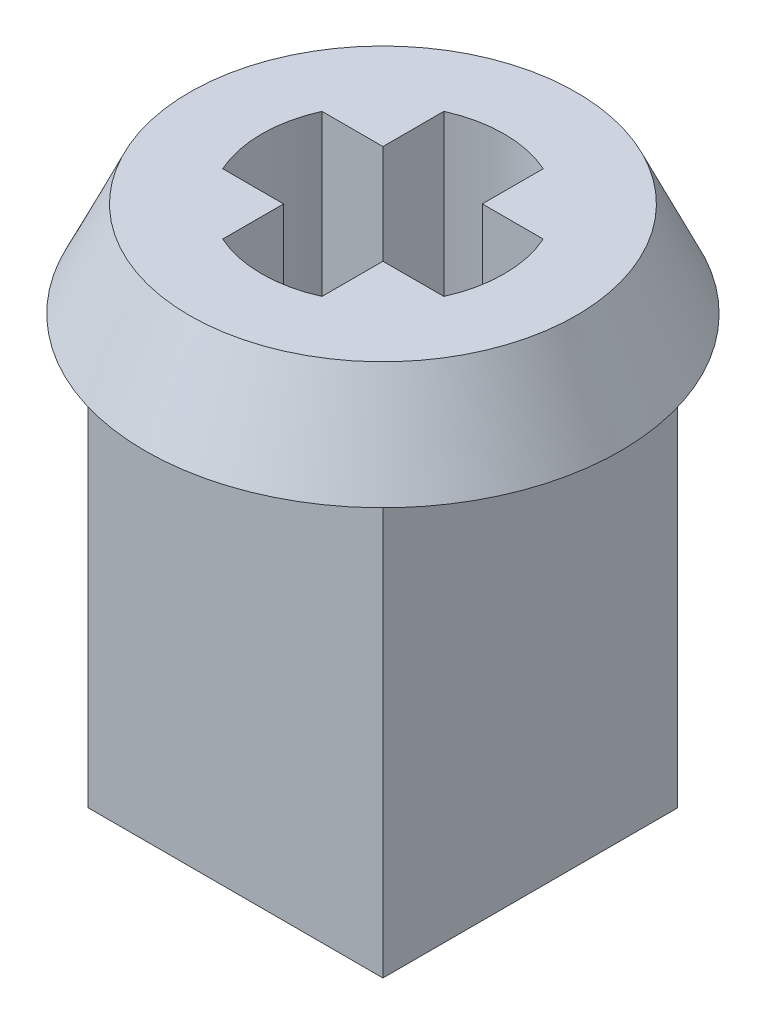
ISO-10303-21;
HEADER;
FILE_DESCRIPTION(('STEP AP214'),'2;1');
FILE_NAME('part.step','',(''),(''),'','','');
FILE_SCHEMA(('AUTOMOTIVE_DESIGN { 1 0 10303 214 1 1 1 1 }'));
ENDSEC;
DATA;
#1=APPLICATION_CONTEXT('core data for automotive mechanical design processes');
#2=APPLICATION_PROTOCOL_DEFINITION('international standard','automotive_design',2000,#1);
#3=PRODUCT_CONTEXT('',#1,'mechanical');
#4=PRODUCT('Part','Part','',(#3));
#5=PRODUCT_RELATED_PRODUCT_CATEGORY('part','',(#4));
#6=PRODUCT_DEFINITION_FORMATION('','',#4);
#7=PRODUCT_DEFINITION_CONTEXT('part definition',#1,'design');
#8=PRODUCT_DEFINITION('design','',#6,#7);
#9=PRODUCT_DEFINITION_SHAPE('','',#8);
#10=(LENGTH_UNIT() NAMED_UNIT(*) SI_UNIT(.MILLI.,.METRE.));
#11=(NAMED_UNIT(*) PLANE_ANGLE_UNIT() SI_UNIT($,.RADIAN.));
#12=(NAMED_UNIT(*) SI_UNIT($,.STERADIAN.) SOLID_ANGLE_UNIT());
#13=UNCERTAINTY_MEASURE_WITH_UNIT(LENGTH_MEASURE(1.E-05),#10,'distance_accuracy_value','');
#14=(GEOMETRIC_REPRESENTATION_CONTEXT(3) GLOBAL_UNCERTAINTY_ASSIGNED_CONTEXT((#13)) GLOBAL_UNIT_ASSIGNED_CONTEXT((#10,
#11,#12)) REPRESENTATION_CONTEXT('',''));
#15=CARTESIAN_POINT('',(0.,0.,0.));
#16=DIRECTION('',(0.,0.,1.));
#17=DIRECTION('',(1.,0.,0.));
#18=AXIS2_PLACEMENT_3D('',#15,#16,#17);
#19=CARTESIAN_POINT('',(0.,0.,0.));
#20=DIRECTION('',(0.,-1.,0.));
#21=DIRECTION('',(0.,0.,-1.));
#22=AXIS2_PLACEMENT_3D('',#19,#20,#21);
#23=PLANE('',#22);
#24=DIRECTION('',(0.,0.,-1.));
#25=VECTOR('',#24,1.);
#26=CARTESIAN_POINT('',(3.1,0.,3.1));
#27=LINE('',#26,#25);
#28=CARTESIAN_POINT('',(3.1,0.,3.1));
#29=VERTEX_POINT('',#28);
#30=CARTESIAN_POINT('',(3.1,0.,-3.1));
#31=VERTEX_POINT('',#30);
#32=EDGE_CURVE('E230',#29,#31,#27,.T.);
#33=ORIENTED_EDGE('',*,*,#32,.F.);
#34=DIRECTION('',(1.,0.,0.));
#35=VECTOR('',#34,1.);
#36=CARTESIAN_POINT('',(-3.1,0.,3.1));
#37=LINE('',#36,#35);
#38=CARTESIAN_POINT('',(-3.1,0.,3.1));
#39=VERTEX_POINT('',#38);
#40=EDGE_CURVE('E235',#39,#29,#37,.T.);
#41=ORIENTED_EDGE('',*,*,#40,.F.);
#42=DIRECTION('',(0.,0.,1.));
#43=VECTOR('',#42,1.);
#44=CARTESIAN_POINT('',(-3.1,0.,3.1));
#45=LINE('',#44,#43);
#46=CARTESIAN_POINT('',(-3.1,0.,-3.1));
#47=VERTEX_POINT('',#46);
#48=EDGE_CURVE('E249',#47,#39,#45,.T.);
#49=ORIENTED_EDGE('',*,*,#48,.F.);
#50=DIRECTION('',(-1.,0.,0.));
#51=VECTOR('',#50,1.);
#52=CARTESIAN_POINT('',(-3.1,0.,-3.1));
#53=LINE('',#52,#51);
#54=EDGE_CURVE('E247',#31,#47,#53,.T.);
#55=ORIENTED_EDGE('',*,*,#54,.F.);
#56=EDGE_LOOP('',(#33,#41,#49,#55));
#57=FACE_BOUND('',#56,.T.);
#58=CARTESIAN_POINT('',(0.,0.,0.));
#59=DIRECTION('',(0.,-1.,0.));
#60=DIRECTION('',(0.,0.,-1.));
#61=AXIS2_PLACEMENT_3D('',#58,#59,#60);
#62=CIRCLE('',#61,2.55);
#63=CARTESIAN_POINT('',(1.045,0.,2.32604277690674));
#64=VERTEX_POINT('',#63);
#65=CARTESIAN_POINT('',(-1.045,0.,2.32604277690674));
#66=VERTEX_POINT('',#65);
#67=EDGE_CURVE('E172',#64,#66,#62,.T.);
#68=ORIENTED_EDGE('',*,*,#67,.F.);
#69=DIRECTION('',(0.,0.,-1.));
#70=VECTOR('',#69,1.);
#71=CARTESIAN_POINT('',(1.045,0.,0.));
#72=LINE('',#71,#70);
#73=CARTESIAN_POINT('',(1.045,0.,1.045));
#74=VERTEX_POINT('',#73);
#75=EDGE_CURVE('E55',#64,#74,#72,.T.);
#76=ORIENTED_EDGE('',*,*,#75,.T.);
#77=DIRECTION('',(-1.,0.,0.));
#78=VECTOR('',#77,1.);
#79=CARTESIAN_POINT('',(0.,0.,1.045));
#80=LINE('',#79,#78);
#81=CARTESIAN_POINT('',(2.32604277690673,0.,1.045));
#82=VERTEX_POINT('',#81);
#83=EDGE_CURVE('E165',#82,#74,#80,.T.);
#84=ORIENTED_EDGE('',*,*,#83,.F.);
#85=CARTESIAN_POINT('',(0.,0.,0.));
#86=DIRECTION('',(0.,-1.,0.));
#87=DIRECTION('',(0.,0.,-1.));
#88=AXIS2_PLACEMENT_3D('',#85,#86,#87);
#89=CIRCLE('',#88,2.55);
#90=CARTESIAN_POINT('',(2.32604277690673,0.,-1.045));
#91=VERTEX_POINT('',#90);
#92=EDGE_CURVE('E203',#91,#82,#89,.T.);
#93=ORIENTED_EDGE('',*,*,#92,.F.);
#94=DIRECTION('',(-1.,0.,0.));
#95=VECTOR('',#94,1.);
#96=CARTESIAN_POINT('',(0.,0.,-1.045));
#97=LINE('',#96,#95);
#98=CARTESIAN_POINT('',(1.045,0.,-1.045));
#99=VERTEX_POINT('',#98);
#100=EDGE_CURVE('E200',#91,#99,#97,.T.);
#101=ORIENTED_EDGE('',*,*,#100,.T.);
#102=DIRECTION('',(0.,0.,-1.));
#103=VECTOR('',#102,1.);
#104=CARTESIAN_POINT('',(1.045,0.,0.));
#105=LINE('',#104,#103);
#106=CARTESIAN_POINT('',(1.045,0.,-2.32604277690674));
#107=VERTEX_POINT('',#106);
#108=EDGE_CURVE('E197',#99,#107,#105,.T.);
#109=ORIENTED_EDGE('',*,*,#108,.T.);
#110=CARTESIAN_POINT('',(0.,0.,0.));
#111=DIRECTION('',(0.,-1.,0.));
#112=DIRECTION('',(0.,0.,-1.));
#113=AXIS2_PLACEMENT_3D('',#110,#111,#112);
#114=CIRCLE('',#113,2.55);
#115=CARTESIAN_POINT('',(-1.045,0.,-2.32604277690674));
#116=VERTEX_POINT('',#115);
#117=EDGE_CURVE('E194',#116,#107,#114,.T.);
#118=ORIENTED_EDGE('',*,*,#117,.F.);
#119=DIRECTION('',(0.,0.,-1.));
#120=VECTOR('',#119,1.);
#121=CARTESIAN_POINT('',(-1.045,0.,0.));
#122=LINE('',#121,#120);
#123=CARTESIAN_POINT('',(-1.045,0.,-1.045));
#124=VERTEX_POINT('',#123);
#125=EDGE_CURVE('E191',#124,#116,#122,.T.);
#126=ORIENTED_EDGE('',*,*,#125,.F.);
#127=DIRECTION('',(-1.,0.,0.));
#128=VECTOR('',#127,1.);
#129=CARTESIAN_POINT('',(0.,0.,-1.045));
#130=LINE('',#129,#128);
#131=CARTESIAN_POINT('',(-2.32604277690674,0.,-1.045));
#132=VERTEX_POINT('',#131);
#133=EDGE_CURVE('E188',#124,#132,#130,.T.);
#134=ORIENTED_EDGE('',*,*,#133,.T.);
#135=CARTESIAN_POINT('',(0.,0.,0.));
#136=DIRECTION('',(0.,-1.,0.));
#137=DIRECTION('',(0.,0.,-1.));
#138=AXIS2_PLACEMENT_3D('',#135,#136,#137);
#139=CIRCLE('',#138,2.55);
#140=CARTESIAN_POINT('',(-2.32604277690674,0.,1.045));
#141=VERTEX_POINT('',#140);
#142=EDGE_CURVE('E185',#141,#132,#139,.T.);
#143=ORIENTED_EDGE('',*,*,#142,.F.);
#144=DIRECTION('',(-1.,0.,0.));
#145=VECTOR('',#144,1.);
#146=CARTESIAN_POINT('',(0.,0.,1.045));
#147=LINE('',#146,#145);
#148=CARTESIAN_POINT('',(-1.045,0.,1.045));
#149=VERTEX_POINT('',#148);
#150=EDGE_CURVE('E182',#149,#141,#147,.T.);
#151=ORIENTED_EDGE('',*,*,#150,.F.);
#152=DIRECTION('',(0.,0.,-1.));
#153=VECTOR('',#152,1.);
#154=CARTESIAN_POINT('',(-1.045,0.,0.));
#155=LINE('',#154,#153);
#156=EDGE_CURVE('E179',#66,#149,#155,.T.);
#157=ORIENTED_EDGE('',*,*,#156,.F.);
#158=EDGE_LOOP('',(#68,#76,#84,#93,#101,#109,#118,#126,#134,#143,#151,#157));
#159=FACE_BOUND('',#158,.T.);
#160=ADVANCED_FACE('F39',(#57,#159),#23,.T.);
#161=CARTESIAN_POINT('',(0.,11.,0.));
#162=DIRECTION('',(0.,1.,0.));
#163=DIRECTION('',(0.,0.,1.));
#164=AXIS2_PLACEMENT_3D('',#161,#162,#163);
#165=PLANE('',#164);
#166=CARTESIAN_POINT('',(0.,11.,0.));
#167=DIRECTION('',(0.,1.,0.));
#168=DIRECTION('',(0.,0.,1.));
#169=AXIS2_PLACEMENT_3D('',#166,#167,#168);
#170=CIRCLE('',#169,4.06738468369);
#171=CARTESIAN_POINT('',(0.,11.,4.06738468369));
#172=VERTEX_POINT('',#171);
#173=EDGE_CURVE('E11',#172,#172,#170,.T.);
#174=ORIENTED_EDGE('',*,*,#173,.T.);
#175=EDGE_LOOP('',(#174));
#176=FACE_BOUND('',#175,.T.);
#177=DIRECTION('',(-1.,0.,0.));
#178=VECTOR('',#177,1.);
#179=CARTESIAN_POINT('',(0.,11.,1.045));
#180=LINE('',#179,#178);
#181=CARTESIAN_POINT('',(2.32604277690674,11.,1.045));
#182=VERTEX_POINT('',#181);
#183=CARTESIAN_POINT('',(1.045,11.,1.045));
#184=VERTEX_POINT('',#183);
#185=EDGE_CURVE('E170',#182,#184,#180,.T.);
#186=ORIENTED_EDGE('',*,*,#185,.T.);
#187=DIRECTION('',(0.,0.,-1.));
#188=VECTOR('',#187,1.);
#189=CARTESIAN_POINT('',(1.045,11.,0.));
#190=LINE('',#189,#188);
#191=CARTESIAN_POINT('',(1.045,11.,2.32604277690674));
#192=VERTEX_POINT('',#191);
#193=EDGE_CURVE('E163',#192,#184,#190,.T.);
#194=ORIENTED_EDGE('',*,*,#193,.F.);
#195=CARTESIAN_POINT('',(0.,11.,0.));
#196=DIRECTION('',(0.,1.,0.));
#197=DIRECTION('',(0.,0.,1.));
#198=AXIS2_PLACEMENT_3D('',#195,#196,#197);
#199=CIRCLE('',#198,2.55);
#200=CARTESIAN_POINT('',(-1.045,11.,2.32604277690674));
#201=VERTEX_POINT('',#200);
#202=EDGE_CURVE('E152',#192,#201,#199,.F.);
#203=ORIENTED_EDGE('',*,*,#202,.T.);
#204=DIRECTION('',(0.,0.,-1.));
#205=VECTOR('',#204,1.);
#206=CARTESIAN_POINT('',(-1.045,11.,0.));
#207=LINE('',#206,#205);
#208=CARTESIAN_POINT('',(-1.045,11.,1.045));
#209=VERTEX_POINT('',#208);
#210=EDGE_CURVE('E506',#201,#209,#207,.T.);
#211=ORIENTED_EDGE('',*,*,#210,.T.);
#212=DIRECTION('',(-1.,0.,0.));
#213=VECTOR('',#212,1.);
#214=CARTESIAN_POINT('',(0.,11.,1.045));
#215=LINE('',#214,#213);
#216=CARTESIAN_POINT('',(-2.32604277690674,11.,1.045));
#217=VERTEX_POINT('',#216);
#218=EDGE_CURVE('E510',#209,#217,#215,.T.);
#219=ORIENTED_EDGE('',*,*,#218,.T.);
#220=CARTESIAN_POINT('',(0.,11.,0.));
#221=DIRECTION('',(0.,1.,0.));
#222=DIRECTION('',(0.,0.,1.));
#223=AXIS2_PLACEMENT_3D('',#220,#221,#222);
#224=CIRCLE('',#223,2.55);
#225=CARTESIAN_POINT('',(-2.32604277690674,11.,-1.045));
#226=VERTEX_POINT('',#225);
#227=EDGE_CURVE('E513',#217,#226,#224,.F.);
#228=ORIENTED_EDGE('',*,*,#227,.T.);
#229=DIRECTION('',(-1.,0.,0.));
#230=VECTOR('',#229,1.);
#231=CARTESIAN_POINT('',(0.,11.,-1.045));
#232=LINE('',#231,#230);
#233=CARTESIAN_POINT('',(-1.045,11.,-1.045));
#234=VERTEX_POINT('',#233);
#235=EDGE_CURVE('E517',#234,#226,#232,.T.);
#236=ORIENTED_EDGE('',*,*,#235,.F.);
#237=DIRECTION('',(0.,0.,-1.));
#238=VECTOR('',#237,1.);
#239=CARTESIAN_POINT('',(-1.045,11.,0.));
#240=LINE('',#239,#238);
#241=CARTESIAN_POINT('',(-1.045,11.,-2.32604277690674));
#242=VERTEX_POINT('',#241);
#243=EDGE_CURVE('E519',#234,#242,#240,.T.);
#244=ORIENTED_EDGE('',*,*,#243,.T.);
#245=CARTESIAN_POINT('',(0.,11.,0.));
#246=DIRECTION('',(0.,1.,0.));
#247=DIRECTION('',(0.,0.,1.));
#248=AXIS2_PLACEMENT_3D('',#245,#246,#247);
#249=CIRCLE('',#248,2.55);
#250=CARTESIAN_POINT('',(1.045,11.,-2.32604277690674));
#251=VERTEX_POINT('',#250);
#252=EDGE_CURVE('E522',#242,#251,#249,.F.);
#253=ORIENTED_EDGE('',*,*,#252,.T.);
#254=DIRECTION('',(0.,0.,-1.));
#255=VECTOR('',#254,1.);
#256=CARTESIAN_POINT('',(1.045,11.,0.));
#257=LINE('',#256,#255);
#258=CARTESIAN_POINT('',(1.045,11.,-1.045));
#259=VERTEX_POINT('',#258);
#260=EDGE_CURVE('E525',#259,#251,#257,.T.);
#261=ORIENTED_EDGE('',*,*,#260,.F.);
#262=DIRECTION('',(-1.,0.,0.));
#263=VECTOR('',#262,1.);
#264=CARTESIAN_POINT('',(0.,11.,-1.045));
#265=LINE('',#264,#263);
#266=CARTESIAN_POINT('',(2.32604277690673,11.,-1.045));
#267=VERTEX_POINT('',#266);
#268=EDGE_CURVE('E527',#267,#259,#265,.T.);
#269=ORIENTED_EDGE('',*,*,#268,.F.);
#270=CARTESIAN_POINT('',(0.,11.,0.));
#271=DIRECTION('',(0.,1.,0.));
#272=DIRECTION('',(0.,0.,1.));
#273=AXIS2_PLACEMENT_3D('',#270,#271,#272);
#274=CIRCLE('',#273,2.55);
#275=EDGE_CURVE('E174',#267,#182,#274,.F.);
#276=ORIENTED_EDGE('',*,*,#275,.T.);
#277=EDGE_LOOP('',(#186,#194,#203,#211,#219,#228,#236,#244,#253,#261,#269,#276));
#278=FACE_BOUND('',#277,.T.);
#279=ADVANCED_FACE('F168',(#176,#278),#165,.T.);
#280=CARTESIAN_POINT('',(3.1,9.,3.1));
#281=DIRECTION('',(-1.,0.,0.));
#282=DIRECTION('',(0.,0.,1.));
#283=AXIS2_PLACEMENT_3D('',#280,#281,#282);
#284=PLANE('',#283);
#285=ORIENTED_EDGE('',*,*,#32,.T.);
#286=DIRECTION('',(0.,-1.,0.));
#287=VECTOR('',#286,1.);
#288=CARTESIAN_POINT('',(3.1,9.,-3.1));
#289=LINE('',#288,#287);
#290=CARTESIAN_POINT('',(3.1,9.,-3.1));
#291=VERTEX_POINT('',#290);
#292=EDGE_CURVE('E48',#291,#31,#289,.T.);
#293=ORIENTED_EDGE('',*,*,#292,.F.);
#294=DIRECTION('',(0.,0.,-1.));
#295=VECTOR('',#294,1.);
#296=CARTESIAN_POINT('',(3.1,9.,3.1));
#297=LINE('',#296,#295);
#298=CARTESIAN_POINT('',(3.1,9.,3.1));
#299=VERTEX_POINT('',#298);
#300=EDGE_CURVE('E231',#299,#291,#297,.T.);
#301=ORIENTED_EDGE('',*,*,#300,.F.);
#302=DIRECTION('',(0.,-1.,0.));
#303=VECTOR('',#302,1.);
#304=CARTESIAN_POINT('',(3.1,9.,3.1));
#305=LINE('',#304,#303);
#306=EDGE_CURVE('E244',#299,#29,#305,.T.);
#307=ORIENTED_EDGE('',*,*,#306,.T.);
#308=EDGE_LOOP('',(#285,#293,#301,#307));
#309=FACE_BOUND('',#308,.T.);
#310=ADVANCED_FACE('F265',(#309),#284,.F.);
#311=CARTESIAN_POINT('',(-3.1,9.,-3.1));
#312=DIRECTION('',(0.,0.,1.));
#313=DIRECTION('',(1.,0.,0.));
#314=AXIS2_PLACEMENT_3D('',#311,#312,#313);
#315=PLANE('',#314);
#316=ORIENTED_EDGE('',*,*,#54,.T.);
#317=DIRECTION('',(0.,-1.,0.));
#318=VECTOR('',#317,1.);
#319=CARTESIAN_POINT('',(-3.1,9.,-3.1));
#320=LINE('',#319,#318);
#321=CARTESIAN_POINT('',(-3.1,9.,-3.1));
#322=VERTEX_POINT('',#321);
#323=EDGE_CURVE('E257',#322,#47,#320,.T.);
#324=ORIENTED_EDGE('',*,*,#323,.F.);
#325=DIRECTION('',(-1.,0.,0.));
#326=VECTOR('',#325,1.);
#327=CARTESIAN_POINT('',(-3.1,9.,-3.1));
#328=LINE('',#327,#326);
#329=EDGE_CURVE('E234',#291,#322,#328,.T.);
#330=ORIENTED_EDGE('',*,*,#329,.F.);
#331=ORIENTED_EDGE('',*,*,#292,.T.);
#332=EDGE_LOOP('',(#316,#324,#330,#331));
#333=FACE_BOUND('',#332,.T.);
#334=ADVANCED_FACE('F262',(#333),#315,.F.);
#335=CARTESIAN_POINT('',(-3.1,9.,3.1));
#336=DIRECTION('',(1.,0.,0.));
#337=DIRECTION('',(0.,0.,-1.));
#338=AXIS2_PLACEMENT_3D('',#335,#336,#337);
#339=PLANE('',#338);
#340=ORIENTED_EDGE('',*,*,#48,.T.);
#341=DIRECTION('',(0.,-1.,0.));
#342=VECTOR('',#341,1.);
#343=CARTESIAN_POINT('',(-3.1,9.,3.1));
#344=LINE('',#343,#342);
#345=CARTESIAN_POINT('',(-3.1,9.,3.1));
#346=VERTEX_POINT('',#345);
#347=EDGE_CURVE('E254',#346,#39,#344,.T.);
#348=ORIENTED_EDGE('',*,*,#347,.F.);
#349=DIRECTION('',(0.,0.,1.));
#350=VECTOR('',#349,1.);
#351=CARTESIAN_POINT('',(-3.1,9.,3.1));
#352=LINE('',#351,#350);
#353=EDGE_CURVE('E238',#322,#346,#352,.T.);
#354=ORIENTED_EDGE('',*,*,#353,.F.);
#355=ORIENTED_EDGE('',*,*,#323,.T.);
#356=EDGE_LOOP('',(#340,#348,#354,#355));
#357=FACE_BOUND('',#356,.T.);
#358=ADVANCED_FACE('F272',(#357),#339,.F.);
#359=CARTESIAN_POINT('',(-3.1,9.,3.1));
#360=DIRECTION('',(0.,0.,-1.));
#361=DIRECTION('',(-1.,0.,0.));
#362=AXIS2_PLACEMENT_3D('',#359,#360,#361);
#363=PLANE('',#362);
#364=ORIENTED_EDGE('',*,*,#40,.T.);
#365=ORIENTED_EDGE('',*,*,#306,.F.);
#366=DIRECTION('',(1.,0.,0.));
#367=VECTOR('',#366,1.);
#368=CARTESIAN_POINT('',(-3.1,9.,3.1));
#369=LINE('',#368,#367);
#370=EDGE_CURVE('E241',#346,#299,#369,.T.);
#371=ORIENTED_EDGE('',*,*,#370,.F.);
#372=ORIENTED_EDGE('',*,*,#347,.T.);
#373=EDGE_LOOP('',(#364,#365,#371,#372));
#374=FACE_BOUND('',#373,.T.);
#375=ADVANCED_FACE('F276',(#374),#363,.F.);
#376=CARTESIAN_POINT('',(0.,9.,0.));
#377=DIRECTION('',(0.,1.,0.));
#378=DIRECTION('',(0.,0.,1.));
#379=AXIS2_PLACEMENT_3D('',#376,#377,#378);
#380=PLANE('',#379);
#381=CARTESIAN_POINT('',(0.,9.,0.));
#382=DIRECTION('',(0.,1.,0.));
#383=DIRECTION('',(0.,0.,1.));
#384=AXIS2_PLACEMENT_3D('',#381,#382,#383);
#385=CIRCLE('',#384,5.);
#386=CARTESIAN_POINT('',(0.,9.,5.));
#387=VERTEX_POINT('',#386);
#388=EDGE_CURVE('E159',#387,#387,#385,.T.);
#389=ORIENTED_EDGE('',*,*,#388,.F.);
#390=EDGE_LOOP('',(#389));
#391=FACE_BOUND('',#390,.T.);
#392=ORIENTED_EDGE('',*,*,#370,.T.);
#393=ORIENTED_EDGE('',*,*,#300,.T.);
#394=ORIENTED_EDGE('',*,*,#329,.T.);
#395=ORIENTED_EDGE('',*,*,#353,.T.);
#396=EDGE_LOOP('',(#392,#393,#394,#395));
#397=FACE_BOUND('',#396,.T.);
#398=ADVANCED_FACE('F278',(#391,#397),#380,.F.);
#399=CARTESIAN_POINT('',(1.045,11.001,0.));
#400=DIRECTION('',(-1.,0.,0.));
#401=DIRECTION('',(0.,0.,1.));
#402=AXIS2_PLACEMENT_3D('',#399,#400,#401);
#403=PLANE('',#402);
#404=ORIENTED_EDGE('',*,*,#193,.T.);
#405=DIRECTION('',(0.,-1.,0.));
#406=VECTOR('',#405,1.);
#407=CARTESIAN_POINT('',(1.045,11.001,1.045));
#408=LINE('',#407,#406);
#409=EDGE_CURVE('E160',#184,#74,#408,.T.);
#410=ORIENTED_EDGE('',*,*,#409,.T.);
#411=ORIENTED_EDGE('',*,*,#75,.F.);
#412=DIRECTION('',(0.,-1.,0.));
#413=VECTOR('',#412,1.);
#414=CARTESIAN_POINT('',(1.045,11.001,2.32604277690674));
#415=LINE('',#414,#413);
#416=EDGE_CURVE('E154',#192,#64,#415,.T.);
#417=ORIENTED_EDGE('',*,*,#416,.F.);
#418=EDGE_LOOP('',(#404,#410,#411,#417));
#419=FACE_BOUND('',#418,.T.);
#420=ADVANCED_FACE('F162',(#419),#403,.T.);
#421=CARTESIAN_POINT('',(0.,11.001,1.045));
#422=DIRECTION('',(0.,0.,1.));
#423=DIRECTION('',(1.,0.,0.));
#424=AXIS2_PLACEMENT_3D('',#421,#422,#423);
#425=PLANE('',#424);
#426=DIRECTION('',(0.,-1.,0.));
#427=VECTOR('',#426,1.);
#428=CARTESIAN_POINT('',(2.32604277690673,11.001,1.045));
#429=LINE('',#428,#427);
#430=EDGE_CURVE('E209',#182,#82,#429,.T.);
#431=ORIENTED_EDGE('',*,*,#430,.T.);
#432=ORIENTED_EDGE('',*,*,#83,.T.);
#433=ORIENTED_EDGE('',*,*,#409,.F.);
#434=ORIENTED_EDGE('',*,*,#185,.F.);
#435=EDGE_LOOP('',(#431,#432,#433,#434));
#436=FACE_BOUND('',#435,.T.);
#437=ADVANCED_FACE('F286',(#436),#425,.F.);
#438=CARTESIAN_POINT('',(0.,11.001,0.));
#439=DIRECTION('',(0.,-1.,0.));
#440=DIRECTION('',(0.,0.,-1.));
#441=AXIS2_PLACEMENT_3D('',#438,#439,#440);
#442=CYLINDRICAL_SURFACE('',#441,2.55);
#443=DIRECTION('',(0.,-1.,0.));
#444=VECTOR('',#443,1.);
#445=CARTESIAN_POINT('',(2.32604277690673,11.001,-1.045));
#446=LINE('',#445,#444);
#447=EDGE_CURVE('E211',#267,#91,#446,.T.);
#448=ORIENTED_EDGE('',*,*,#447,.T.);
#449=ORIENTED_EDGE('',*,*,#92,.T.);
#450=ORIENTED_EDGE('',*,*,#430,.F.);
#451=ORIENTED_EDGE('',*,*,#275,.F.);
#452=EDGE_LOOP('',(#448,#449,#450,#451));
#453=FACE_BOUND('',#452,.T.);
#454=ADVANCED_FACE('F346',(#453),#442,.F.);
#455=CARTESIAN_POINT('',(0.,11.001,-1.045));
#456=DIRECTION('',(0.,0.,1.));
#457=DIRECTION('',(1.,0.,0.));
#458=AXIS2_PLACEMENT_3D('',#455,#456,#457);
#459=PLANE('',#458);
#460=ORIENTED_EDGE('',*,*,#268,.T.);
#461=DIRECTION('',(0.,-1.,0.));
#462=VECTOR('',#461,1.);
#463=CARTESIAN_POINT('',(1.045,11.001,-1.045));
#464=LINE('',#463,#462);
#465=EDGE_CURVE('E213',#259,#99,#464,.T.);
#466=ORIENTED_EDGE('',*,*,#465,.T.);
#467=ORIENTED_EDGE('',*,*,#100,.F.);
#468=ORIENTED_EDGE('',*,*,#447,.F.);
#469=EDGE_LOOP('',(#460,#466,#467,#468));
#470=FACE_BOUND('',#469,.T.);
#471=ADVANCED_FACE('F357',(#470),#459,.T.);
#472=CARTESIAN_POINT('',(1.045,11.001,0.));
#473=DIRECTION('',(-1.,0.,0.));
#474=DIRECTION('',(0.,0.,1.));
#475=AXIS2_PLACEMENT_3D('',#472,#473,#474);
#476=PLANE('',#475);
#477=ORIENTED_EDGE('',*,*,#260,.T.);
#478=DIRECTION('',(0.,-1.,0.));
#479=VECTOR('',#478,1.);
#480=CARTESIAN_POINT('',(1.045,11.001,-2.32604277690674));
#481=LINE('',#480,#479);
#482=EDGE_CURVE('E215',#251,#107,#481,.T.);
#483=ORIENTED_EDGE('',*,*,#482,.T.);
#484=ORIENTED_EDGE('',*,*,#108,.F.);
#485=ORIENTED_EDGE('',*,*,#465,.F.);
#486=EDGE_LOOP('',(#477,#483,#484,#485));
#487=FACE_BOUND('',#486,.T.);
#488=ADVANCED_FACE('F368',(#487),#476,.T.);
#489=CARTESIAN_POINT('',(0.,11.001,0.));
#490=DIRECTION('',(0.,-1.,0.));
#491=DIRECTION('',(0.,0.,-1.));
#492=AXIS2_PLACEMENT_3D('',#489,#490,#491);
#493=CYLINDRICAL_SURFACE('',#492,2.55);
#494=DIRECTION('',(0.,-1.,0.));
#495=VECTOR('',#494,1.);
#496=CARTESIAN_POINT('',(-1.045,11.001,-2.32604277690674));
#497=LINE('',#496,#495);
#498=EDGE_CURVE('E217',#242,#116,#497,.T.);
#499=ORIENTED_EDGE('',*,*,#498,.T.);
#500=ORIENTED_EDGE('',*,*,#117,.T.);
#501=ORIENTED_EDGE('',*,*,#482,.F.);
#502=ORIENTED_EDGE('',*,*,#252,.F.);
#503=EDGE_LOOP('',(#499,#500,#501,#502));
#504=FACE_BOUND('',#503,.T.);
#505=ADVANCED_FACE('F379',(#504),#493,.F.);
#506=CARTESIAN_POINT('',(-1.045,11.001,0.));
#507=DIRECTION('',(-1.,0.,0.));
#508=DIRECTION('',(0.,0.,1.));
#509=AXIS2_PLACEMENT_3D('',#506,#507,#508);
#510=PLANE('',#509);
#511=DIRECTION('',(0.,-1.,0.));
#512=VECTOR('',#511,1.);
#513=CARTESIAN_POINT('',(-1.045,11.001,-1.045));
#514=LINE('',#513,#512);
#515=EDGE_CURVE('E219',#234,#124,#514,.T.);
#516=ORIENTED_EDGE('',*,*,#515,.T.);
#517=ORIENTED_EDGE('',*,*,#125,.T.);
#518=ORIENTED_EDGE('',*,*,#498,.F.);
#519=ORIENTED_EDGE('',*,*,#243,.F.);
#520=EDGE_LOOP('',(#516,#517,#518,#519));
#521=FACE_BOUND('',#520,.T.);
#522=ADVANCED_FACE('F390',(#521),#510,.F.);
#523=CARTESIAN_POINT('',(0.,11.001,-1.045));
#524=DIRECTION('',(0.,0.,1.));
#525=DIRECTION('',(1.,0.,0.));
#526=AXIS2_PLACEMENT_3D('',#523,#524,#525);
#527=PLANE('',#526);
#528=ORIENTED_EDGE('',*,*,#235,.T.);
#529=DIRECTION('',(0.,-1.,0.));
#530=VECTOR('',#529,1.);
#531=CARTESIAN_POINT('',(-2.32604277690674,11.001,-1.045));
#532=LINE('',#531,#530);
#533=EDGE_CURVE('E221',#226,#132,#532,.T.);
#534=ORIENTED_EDGE('',*,*,#533,.T.);
#535=ORIENTED_EDGE('',*,*,#133,.F.);
#536=ORIENTED_EDGE('',*,*,#515,.F.);
#537=EDGE_LOOP('',(#528,#534,#535,#536));
#538=FACE_BOUND('',#537,.T.);
#539=ADVANCED_FACE('F401',(#538),#527,.T.);
#540=CARTESIAN_POINT('',(0.,11.001,0.));
#541=DIRECTION('',(0.,-1.,0.));
#542=DIRECTION('',(0.,0.,-1.));
#543=AXIS2_PLACEMENT_3D('',#540,#541,#542);
#544=CYLINDRICAL_SURFACE('',#543,2.55);
#545=DIRECTION('',(0.,-1.,0.));
#546=VECTOR('',#545,1.);
#547=CARTESIAN_POINT('',(-2.32604277690674,11.001,1.045));
#548=LINE('',#547,#546);
#549=EDGE_CURVE('E223',#217,#141,#548,.T.);
#550=ORIENTED_EDGE('',*,*,#549,.T.);
#551=ORIENTED_EDGE('',*,*,#142,.T.);
#552=ORIENTED_EDGE('',*,*,#533,.F.);
#553=ORIENTED_EDGE('',*,*,#227,.F.);
#554=EDGE_LOOP('',(#550,#551,#552,#553));
#555=FACE_BOUND('',#554,.T.);
#556=ADVANCED_FACE('F412',(#555),#544,.F.);
#557=CARTESIAN_POINT('',(0.,11.001,1.045));
#558=DIRECTION('',(0.,0.,1.));
#559=DIRECTION('',(1.,0.,0.));
#560=AXIS2_PLACEMENT_3D('',#557,#558,#559);
#561=PLANE('',#560);
#562=DIRECTION('',(0.,-1.,0.));
#563=VECTOR('',#562,1.);
#564=CARTESIAN_POINT('',(-1.045,11.001,1.045));
#565=LINE('',#564,#563);
#566=EDGE_CURVE('E225',#209,#149,#565,.T.);
#567=ORIENTED_EDGE('',*,*,#566,.T.);
#568=ORIENTED_EDGE('',*,*,#150,.T.);
#569=ORIENTED_EDGE('',*,*,#549,.F.);
#570=ORIENTED_EDGE('',*,*,#218,.F.);
#571=EDGE_LOOP('',(#567,#568,#569,#570));
#572=FACE_BOUND('',#571,.T.);
#573=ADVANCED_FACE('F423',(#572),#561,.F.);
#574=CARTESIAN_POINT('',(-1.045,11.001,0.));
#575=DIRECTION('',(-1.,0.,0.));
#576=DIRECTION('',(0.,0.,1.));
#577=AXIS2_PLACEMENT_3D('',#574,#575,#576);
#578=PLANE('',#577);
#579=DIRECTION('',(0.,-1.,0.));
#580=VECTOR('',#579,1.);
#581=CARTESIAN_POINT('',(-1.045,11.001,2.32604277690674));
#582=LINE('',#581,#580);
#583=EDGE_CURVE('E63',#201,#66,#582,.T.);
#584=ORIENTED_EDGE('',*,*,#583,.T.);
#585=ORIENTED_EDGE('',*,*,#156,.T.);
#586=ORIENTED_EDGE('',*,*,#566,.F.);
#587=ORIENTED_EDGE('',*,*,#210,.F.);
#588=EDGE_LOOP('',(#584,#585,#586,#587));
#589=FACE_BOUND('',#588,.T.);
#590=ADVANCED_FACE('F434',(#589),#578,.F.);
#591=CARTESIAN_POINT('',(0.,11.001,0.));
#592=DIRECTION('',(0.,-1.,0.));
#593=DIRECTION('',(0.,0.,-1.));
#594=AXIS2_PLACEMENT_3D('',#591,#592,#593);
#595=CYLINDRICAL_SURFACE('',#594,2.55);
#596=ORIENTED_EDGE('',*,*,#416,.T.);
#597=ORIENTED_EDGE('',*,*,#67,.T.);
#598=ORIENTED_EDGE('',*,*,#583,.F.);
#599=ORIENTED_EDGE('',*,*,#202,.F.);
#600=EDGE_LOOP('',(#596,#597,#598,#599));
#601=FACE_BOUND('',#600,.T.);
#602=ADVANCED_FACE('F153',(#601),#595,.F.);
#603=CARTESIAN_POINT('',(0.,11.,0.));
#604=DIRECTION('',(0.,-1.,0.));
#605=DIRECTION('',(0.,0.,-1.));
#606=AXIS2_PLACEMENT_3D('',#603,#604,#605);
#607=CONICAL_SURFACE('',#606,4.06738468369,0.43633231299858);
#608=ORIENTED_EDGE('',*,*,#388,.T.);
#609=EDGE_LOOP('',(#608));
#610=FACE_BOUND('',#609,.T.);
#611=ORIENTED_EDGE('',*,*,#173,.F.);
#612=EDGE_LOOP('',(#611));
#613=FACE_BOUND('',#612,.T.);
#614=ADVANCED_FACE('F42',(#610,#613),#607,.T.);
#615=CLOSED_SHELL('',(#160,#279,#310,#334,#358,#375,#398,#420,#437,#454,#471,#488,#505,#522,
#539,#556,#573,#590,#602,#614));
#616=MANIFOLD_SOLID_BREP('B2',#615);
#617=ADVANCED_BREP_SHAPE_REPRESENTATION('',(#18,#616),#14);
#618=SHAPE_DEFINITION_REPRESENTATION(#9,#617);
ENDSEC;
END-ISO-10303-21;
